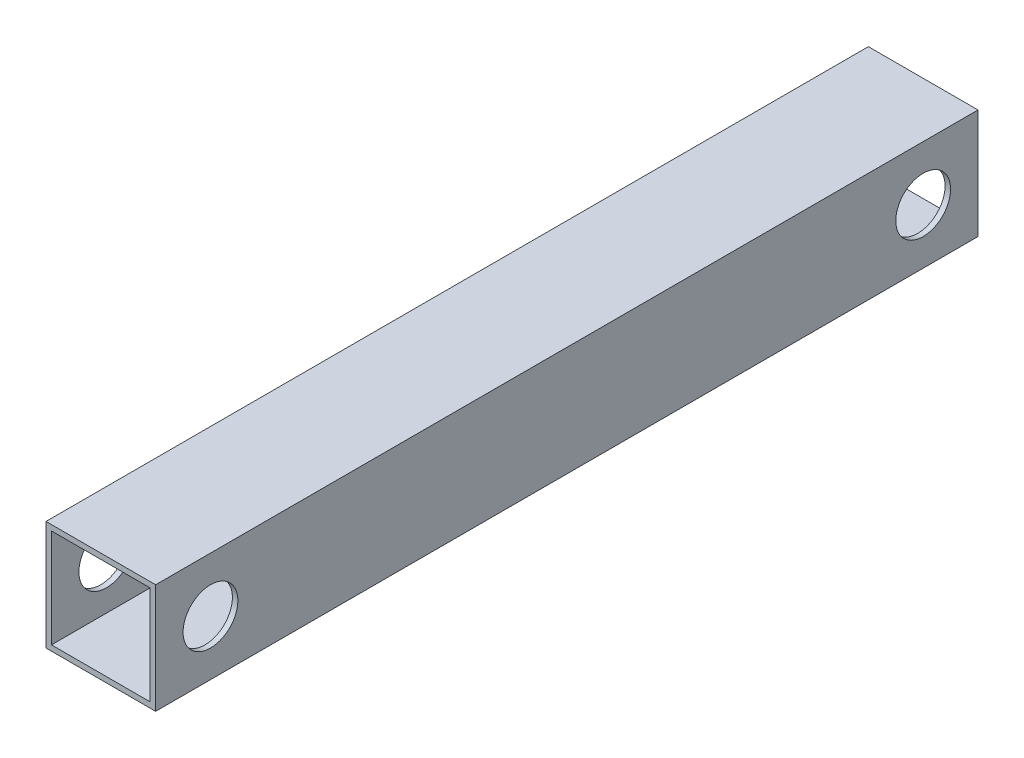
ISO-10303-21;
HEADER;
FILE_DESCRIPTION(('STEP AP214'),'2;1');
FILE_NAME('part.step','',(''),(''),'','','');
FILE_SCHEMA(('AUTOMOTIVE_DESIGN { 1 0 10303 214 1 1 1 1 }'));
ENDSEC;
DATA;
#1=APPLICATION_CONTEXT('core data for automotive mechanical design processes');
#2=APPLICATION_PROTOCOL_DEFINITION('international standard','automotive_design',2000,#1);
#3=PRODUCT_CONTEXT('',#1,'mechanical');
#4=PRODUCT('Part','Part','',(#3));
#5=PRODUCT_RELATED_PRODUCT_CATEGORY('part','',(#4));
#6=PRODUCT_DEFINITION_FORMATION('','',#4);
#7=PRODUCT_DEFINITION_CONTEXT('part definition',#1,'design');
#8=PRODUCT_DEFINITION('design','',#6,#7);
#9=PRODUCT_DEFINITION_SHAPE('','',#8);
#10=(LENGTH_UNIT() NAMED_UNIT(*) SI_UNIT(.MILLI.,.METRE.));
#11=(NAMED_UNIT(*) PLANE_ANGLE_UNIT() SI_UNIT($,.RADIAN.));
#12=(NAMED_UNIT(*) SI_UNIT($,.STERADIAN.) SOLID_ANGLE_UNIT());
#13=UNCERTAINTY_MEASURE_WITH_UNIT(LENGTH_MEASURE(1.E-05),#10,'distance_accuracy_value','');
#14=(GEOMETRIC_REPRESENTATION_CONTEXT(3) GLOBAL_UNCERTAINTY_ASSIGNED_CONTEXT((#13)) GLOBAL_UNIT_ASSIGNED_CONTEXT((#10,
#11,#12)) REPRESENTATION_CONTEXT('',''));
#15=CARTESIAN_POINT('',(0.,0.,0.));
#16=DIRECTION('',(0.,0.,1.));
#17=DIRECTION('',(1.,0.,0.));
#18=AXIS2_PLACEMENT_3D('',#15,#16,#17);
#19=CARTESIAN_POINT('',(0.,0.,150.));
#20=DIRECTION('',(0.,0.,-1.));
#21=DIRECTION('',(-1.,0.,0.));
#22=AXIS2_PLACEMENT_3D('',#19,#20,#21);
#23=PLANE('',#22);
#24=DIRECTION('',(0.,1.,0.));
#25=VECTOR('',#24,1.);
#26=CARTESIAN_POINT('',(10.,-10.,150.));
#27=LINE('',#26,#25);
#28=CARTESIAN_POINT('',(10.,-10.,150.));
#29=VERTEX_POINT('',#28);
#30=CARTESIAN_POINT('',(10.,10.,150.));
#31=VERTEX_POINT('',#30);
#32=EDGE_CURVE('E157',#29,#31,#27,.T.);
#33=ORIENTED_EDGE('',*,*,#32,.T.);
#34=DIRECTION('',(-1.,0.,0.));
#35=VECTOR('',#34,1.);
#36=CARTESIAN_POINT('',(-10.,10.,150.));
#37=LINE('',#36,#35);
#38=CARTESIAN_POINT('',(-10.,10.,150.));
#39=VERTEX_POINT('',#38);
#40=EDGE_CURVE('E161',#31,#39,#37,.T.);
#41=ORIENTED_EDGE('',*,*,#40,.T.);
#42=DIRECTION('',(0.,-1.,0.));
#43=VECTOR('',#42,1.);
#44=CARTESIAN_POINT('',(-10.,-10.,150.));
#45=LINE('',#44,#43);
#46=CARTESIAN_POINT('',(-10.,-10.,150.));
#47=VERTEX_POINT('',#46);
#48=EDGE_CURVE('E165',#39,#47,#45,.T.);
#49=ORIENTED_EDGE('',*,*,#48,.T.);
#50=DIRECTION('',(1.,0.,0.));
#51=VECTOR('',#50,1.);
#52=CARTESIAN_POINT('',(-10.,-10.,150.));
#53=LINE('',#52,#51);
#54=EDGE_CURVE('E168',#47,#29,#53,.T.);
#55=ORIENTED_EDGE('',*,*,#54,.T.);
#56=EDGE_LOOP('',(#33,#41,#49,#55));
#57=FACE_BOUND('',#56,.T.);
#58=DIRECTION('',(0.,1.,0.));
#59=VECTOR('',#58,1.);
#60=CARTESIAN_POINT('',(9.,9.,150.));
#61=LINE('',#60,#59);
#62=CARTESIAN_POINT('',(9.,-9.,150.));
#63=VERTEX_POINT('',#62);
#64=CARTESIAN_POINT('',(9.,9.,150.));
#65=VERTEX_POINT('',#64);
#66=EDGE_CURVE('E107',#63,#65,#61,.T.);
#67=ORIENTED_EDGE('',*,*,#66,.F.);
#68=DIRECTION('',(1.,0.,0.));
#69=VECTOR('',#68,1.);
#70=CARTESIAN_POINT('',(-9.,-9.,150.));
#71=LINE('',#70,#69);
#72=CARTESIAN_POINT('',(-9.,-9.,150.));
#73=VERTEX_POINT('',#72);
#74=EDGE_CURVE('E133',#73,#63,#71,.T.);
#75=ORIENTED_EDGE('',*,*,#74,.F.);
#76=DIRECTION('',(0.,-1.,0.));
#77=VECTOR('',#76,1.);
#78=CARTESIAN_POINT('',(-9.,9.,150.));
#79=LINE('',#78,#77);
#80=CARTESIAN_POINT('',(-9.,9.,150.));
#81=VERTEX_POINT('',#80);
#82=EDGE_CURVE('E129',#81,#73,#79,.T.);
#83=ORIENTED_EDGE('',*,*,#82,.F.);
#84=DIRECTION('',(-1.,0.,0.));
#85=VECTOR('',#84,1.);
#86=CARTESIAN_POINT('',(-9.,9.,150.));
#87=LINE('',#86,#85);
#88=EDGE_CURVE('E116',#65,#81,#87,.T.);
#89=ORIENTED_EDGE('',*,*,#88,.F.);
#90=EDGE_LOOP('',(#67,#75,#83,#89));
#91=FACE_BOUND('',#90,.T.);
#92=ADVANCED_FACE('F39',(#57,#91),#23,.F.);
#93=CARTESIAN_POINT('',(0.,0.,0.));
#94=DIRECTION('',(0.,0.,-1.));
#95=DIRECTION('',(-1.,0.,0.));
#96=AXIS2_PLACEMENT_3D('',#93,#94,#95);
#97=PLANE('',#96);
#98=DIRECTION('',(0.,1.,0.));
#99=VECTOR('',#98,1.);
#100=CARTESIAN_POINT('',(10.,-10.,0.));
#101=LINE('',#100,#99);
#102=CARTESIAN_POINT('',(10.,-10.,0.));
#103=VERTEX_POINT('',#102);
#104=CARTESIAN_POINT('',(10.,10.,0.));
#105=VERTEX_POINT('',#104);
#106=EDGE_CURVE('E125',#103,#105,#101,.T.);
#107=ORIENTED_EDGE('',*,*,#106,.F.);
#108=DIRECTION('',(1.,0.,0.));
#109=VECTOR('',#108,1.);
#110=CARTESIAN_POINT('',(-10.,-10.,0.));
#111=LINE('',#110,#109);
#112=CARTESIAN_POINT('',(-10.,-10.,0.));
#113=VERTEX_POINT('',#112);
#114=EDGE_CURVE('E162',#113,#103,#111,.T.);
#115=ORIENTED_EDGE('',*,*,#114,.F.);
#116=DIRECTION('',(0.,-1.,0.));
#117=VECTOR('',#116,1.);
#118=CARTESIAN_POINT('',(-10.,-10.,0.));
#119=LINE('',#118,#117);
#120=CARTESIAN_POINT('',(-10.,10.,0.));
#121=VERTEX_POINT('',#120);
#122=EDGE_CURVE('E178',#121,#113,#119,.T.);
#123=ORIENTED_EDGE('',*,*,#122,.F.);
#124=DIRECTION('',(-1.,0.,0.));
#125=VECTOR('',#124,1.);
#126=CARTESIAN_POINT('',(-10.,10.,0.));
#127=LINE('',#126,#125);
#128=EDGE_CURVE('E175',#105,#121,#127,.T.);
#129=ORIENTED_EDGE('',*,*,#128,.F.);
#130=EDGE_LOOP('',(#107,#115,#123,#129));
#131=FACE_BOUND('',#130,.T.);
#132=DIRECTION('',(1.,0.,0.));
#133=VECTOR('',#132,1.);
#134=CARTESIAN_POINT('',(-9.,-9.,0.));
#135=LINE('',#134,#133);
#136=CARTESIAN_POINT('',(-9.,-9.,0.));
#137=VERTEX_POINT('',#136);
#138=CARTESIAN_POINT('',(9.,-9.,0.));
#139=VERTEX_POINT('',#138);
#140=EDGE_CURVE('E117',#137,#139,#135,.T.);
#141=ORIENTED_EDGE('',*,*,#140,.T.);
#142=DIRECTION('',(0.,1.,0.));
#143=VECTOR('',#142,1.);
#144=CARTESIAN_POINT('',(9.,9.,0.));
#145=LINE('',#144,#143);
#146=CARTESIAN_POINT('',(9.,9.,0.));
#147=VERTEX_POINT('',#146);
#148=EDGE_CURVE('E65',#139,#147,#145,.T.);
#149=ORIENTED_EDGE('',*,*,#148,.T.);
#150=DIRECTION('',(-1.,0.,0.));
#151=VECTOR('',#150,1.);
#152=CARTESIAN_POINT('',(-9.,9.,0.));
#153=LINE('',#152,#151);
#154=CARTESIAN_POINT('',(-9.,9.,0.));
#155=VERTEX_POINT('',#154);
#156=EDGE_CURVE('E123',#147,#155,#153,.T.);
#157=ORIENTED_EDGE('',*,*,#156,.T.);
#158=DIRECTION('',(0.,-1.,0.));
#159=VECTOR('',#158,1.);
#160=CARTESIAN_POINT('',(-9.,9.,0.));
#161=LINE('',#160,#159);
#162=EDGE_CURVE('E144',#155,#137,#161,.T.);
#163=ORIENTED_EDGE('',*,*,#162,.T.);
#164=EDGE_LOOP('',(#141,#149,#157,#163));
#165=FACE_BOUND('',#164,.T.);
#166=ADVANCED_FACE('F244',(#131,#165),#97,.T.);
#167=CARTESIAN_POINT('',(10.,-10.,150.));
#168=DIRECTION('',(-1.,0.,0.));
#169=DIRECTION('',(0.,0.,1.));
#170=AXIS2_PLACEMENT_3D('',#167,#168,#169);
#171=PLANE('',#170);
#172=CARTESIAN_POINT('',(10.,0.,140.));
#173=DIRECTION('',(1.,0.,0.));
#174=DIRECTION('',(0.,0.,-1.));
#175=AXIS2_PLACEMENT_3D('',#172,#173,#174);
#176=CIRCLE('',#175,5.00000000000002);
#177=CARTESIAN_POINT('',(10.,0.,135.));
#178=VERTEX_POINT('',#177);
#179=EDGE_CURVE('E196',#178,#178,#176,.T.);
#180=ORIENTED_EDGE('',*,*,#179,.F.);
#181=EDGE_LOOP('',(#180));
#182=FACE_BOUND('',#181,.T.);
#183=CARTESIAN_POINT('',(10.,0.,10.));
#184=DIRECTION('',(1.,0.,0.));
#185=DIRECTION('',(0.,0.,1.));
#186=AXIS2_PLACEMENT_3D('',#183,#184,#185);
#187=CIRCLE('',#186,5.00000000000002);
#188=CARTESIAN_POINT('',(10.,0.,15.));
#189=VERTEX_POINT('',#188);
#190=EDGE_CURVE('E205',#189,#189,#187,.T.);
#191=ORIENTED_EDGE('',*,*,#190,.F.);
#192=EDGE_LOOP('',(#191));
#193=FACE_BOUND('',#192,.T.);
#194=ORIENTED_EDGE('',*,*,#106,.T.);
#195=DIRECTION('',(0.,0.,-1.));
#196=VECTOR('',#195,1.);
#197=CARTESIAN_POINT('',(10.,10.,150.));
#198=LINE('',#197,#196);
#199=EDGE_CURVE('E11',#31,#105,#198,.T.);
#200=ORIENTED_EDGE('',*,*,#199,.F.);
#201=ORIENTED_EDGE('',*,*,#32,.F.);
#202=DIRECTION('',(0.,0.,-1.));
#203=VECTOR('',#202,1.);
#204=CARTESIAN_POINT('',(10.,-10.,150.));
#205=LINE('',#204,#203);
#206=EDGE_CURVE('E171',#29,#103,#205,.T.);
#207=ORIENTED_EDGE('',*,*,#206,.T.);
#208=EDGE_LOOP('',(#194,#200,#201,#207));
#209=FACE_BOUND('',#208,.T.);
#210=ADVANCED_FACE('F41',(#182,#193,#209),#171,.F.);
#211=CARTESIAN_POINT('',(-10.,10.,150.));
#212=DIRECTION('',(0.,-1.,0.));
#213=DIRECTION('',(0.,0.,-1.));
#214=AXIS2_PLACEMENT_3D('',#211,#212,#213);
#215=PLANE('',#214);
#216=ORIENTED_EDGE('',*,*,#128,.T.);
#217=DIRECTION('',(0.,0.,-1.));
#218=VECTOR('',#217,1.);
#219=CARTESIAN_POINT('',(-10.,10.,150.));
#220=LINE('',#219,#218);
#221=EDGE_CURVE('E49',#39,#121,#220,.T.);
#222=ORIENTED_EDGE('',*,*,#221,.F.);
#223=ORIENTED_EDGE('',*,*,#40,.F.);
#224=ORIENTED_EDGE('',*,*,#199,.T.);
#225=EDGE_LOOP('',(#216,#222,#223,#224));
#226=FACE_BOUND('',#225,.T.);
#227=ADVANCED_FACE('F260',(#226),#215,.F.);
#228=CARTESIAN_POINT('',(-10.,-10.,150.));
#229=DIRECTION('',(1.,0.,0.));
#230=DIRECTION('',(0.,0.,-1.));
#231=AXIS2_PLACEMENT_3D('',#228,#229,#230);
#232=PLANE('',#231);
#233=CARTESIAN_POINT('',(-10.,0.,140.));
#234=DIRECTION('',(1.,0.,0.));
#235=DIRECTION('',(0.,0.,-1.));
#236=AXIS2_PLACEMENT_3D('',#233,#234,#235);
#237=CIRCLE('',#236,5.00000000000002);
#238=CARTESIAN_POINT('',(-10.,0.,135.));
#239=VERTEX_POINT('',#238);
#240=EDGE_CURVE('E141',#239,#239,#237,.T.);
#241=ORIENTED_EDGE('',*,*,#240,.T.);
#242=EDGE_LOOP('',(#241));
#243=FACE_BOUND('',#242,.T.);
#244=CARTESIAN_POINT('',(-10.,0.,10.));
#245=DIRECTION('',(1.,0.,0.));
#246=DIRECTION('',(0.,0.,-1.));
#247=AXIS2_PLACEMENT_3D('',#244,#245,#246);
#248=CIRCLE('',#247,5.00000000000002);
#249=CARTESIAN_POINT('',(-10.,0.,4.99999999999999));
#250=VERTEX_POINT('',#249);
#251=EDGE_CURVE('E202',#250,#250,#248,.T.);
#252=ORIENTED_EDGE('',*,*,#251,.T.);
#253=EDGE_LOOP('',(#252));
#254=FACE_BOUND('',#253,.T.);
#255=ORIENTED_EDGE('',*,*,#122,.T.);
#256=DIRECTION('',(0.,0.,-1.));
#257=VECTOR('',#256,1.);
#258=CARTESIAN_POINT('',(-10.,-10.,150.));
#259=LINE('',#258,#257);
#260=EDGE_CURVE('E186',#47,#113,#259,.T.);
#261=ORIENTED_EDGE('',*,*,#260,.F.);
#262=ORIENTED_EDGE('',*,*,#48,.F.);
#263=ORIENTED_EDGE('',*,*,#221,.T.);
#264=EDGE_LOOP('',(#255,#261,#262,#263));
#265=FACE_BOUND('',#264,.T.);
#266=ADVANCED_FACE('F223',(#243,#254,#265),#232,.F.);
#267=CARTESIAN_POINT('',(-10.,-10.,150.));
#268=DIRECTION('',(0.,1.,0.));
#269=DIRECTION('',(0.,0.,1.));
#270=AXIS2_PLACEMENT_3D('',#267,#268,#269);
#271=PLANE('',#270);
#272=ORIENTED_EDGE('',*,*,#114,.T.);
#273=ORIENTED_EDGE('',*,*,#206,.F.);
#274=ORIENTED_EDGE('',*,*,#54,.F.);
#275=ORIENTED_EDGE('',*,*,#260,.T.);
#276=EDGE_LOOP('',(#272,#273,#274,#275));
#277=FACE_BOUND('',#276,.T.);
#278=ADVANCED_FACE('F255',(#277),#271,.F.);
#279=CARTESIAN_POINT('',(9.,9.,150.));
#280=DIRECTION('',(-1.,0.,0.));
#281=DIRECTION('',(0.,0.,1.));
#282=AXIS2_PLACEMENT_3D('',#279,#280,#281);
#283=PLANE('',#282);
#284=CARTESIAN_POINT('',(9.00000000000001,0.,140.));
#285=DIRECTION('',(-1.,0.,0.));
#286=DIRECTION('',(0.,0.,1.));
#287=AXIS2_PLACEMENT_3D('',#284,#285,#286);
#288=CIRCLE('',#287,5.00000000000002);
#289=CARTESIAN_POINT('',(9.00000000000001,0.,145.));
#290=VERTEX_POINT('',#289);
#291=EDGE_CURVE('E216',#290,#290,#288,.T.);
#292=ORIENTED_EDGE('',*,*,#291,.F.);
#293=EDGE_LOOP('',(#292));
#294=FACE_BOUND('',#293,.T.);
#295=CARTESIAN_POINT('',(9.00000000000001,0.,10.));
#296=DIRECTION('',(-1.,0.,0.));
#297=DIRECTION('',(0.,0.,1.));
#298=AXIS2_PLACEMENT_3D('',#295,#296,#297);
#299=CIRCLE('',#298,5.00000000000002);
#300=CARTESIAN_POINT('',(9.00000000000001,0.,15.));
#301=VERTEX_POINT('',#300);
#302=EDGE_CURVE('E195',#301,#301,#299,.T.);
#303=ORIENTED_EDGE('',*,*,#302,.F.);
#304=EDGE_LOOP('',(#303));
#305=FACE_BOUND('',#304,.T.);
#306=ORIENTED_EDGE('',*,*,#148,.F.);
#307=DIRECTION('',(0.,0.,-1.));
#308=VECTOR('',#307,1.);
#309=CARTESIAN_POINT('',(9.,-9.,150.));
#310=LINE('',#309,#308);
#311=EDGE_CURVE('E111',#63,#139,#310,.T.);
#312=ORIENTED_EDGE('',*,*,#311,.F.);
#313=ORIENTED_EDGE('',*,*,#66,.T.);
#314=DIRECTION('',(0.,0.,-1.));
#315=VECTOR('',#314,1.);
#316=CARTESIAN_POINT('',(9.,9.,150.));
#317=LINE('',#316,#315);
#318=EDGE_CURVE('E110',#65,#147,#317,.T.);
#319=ORIENTED_EDGE('',*,*,#318,.T.);
#320=EDGE_LOOP('',(#306,#312,#313,#319));
#321=FACE_BOUND('',#320,.T.);
#322=ADVANCED_FACE('F109',(#294,#305,#321),#283,.T.);
#323=CARTESIAN_POINT('',(-9.,9.,150.));
#324=DIRECTION('',(0.,-1.,0.));
#325=DIRECTION('',(0.,0.,-1.));
#326=AXIS2_PLACEMENT_3D('',#323,#324,#325);
#327=PLANE('',#326);
#328=ORIENTED_EDGE('',*,*,#156,.F.);
#329=ORIENTED_EDGE('',*,*,#318,.F.);
#330=ORIENTED_EDGE('',*,*,#88,.T.);
#331=DIRECTION('',(0.,0.,-1.));
#332=VECTOR('',#331,1.);
#333=CARTESIAN_POINT('',(-9.,9.,150.));
#334=LINE('',#333,#332);
#335=EDGE_CURVE('E126',#81,#155,#334,.T.);
#336=ORIENTED_EDGE('',*,*,#335,.T.);
#337=EDGE_LOOP('',(#328,#329,#330,#336));
#338=FACE_BOUND('',#337,.T.);
#339=ADVANCED_FACE('F120',(#338),#327,.T.);
#340=CARTESIAN_POINT('',(-9.,9.,150.));
#341=DIRECTION('',(1.,0.,0.));
#342=DIRECTION('',(0.,0.,-1.));
#343=AXIS2_PLACEMENT_3D('',#340,#341,#342);
#344=PLANE('',#343);
#345=CARTESIAN_POINT('',(-9.00000000000001,0.,140.));
#346=DIRECTION('',(1.,0.,0.));
#347=DIRECTION('',(0.,0.,-1.));
#348=AXIS2_PLACEMENT_3D('',#345,#346,#347);
#349=CIRCLE('',#348,5.00000000000002);
#350=CARTESIAN_POINT('',(-9.00000000000001,0.,135.));
#351=VERTEX_POINT('',#350);
#352=EDGE_CURVE('E43',#351,#351,#349,.T.);
#353=ORIENTED_EDGE('',*,*,#352,.F.);
#354=EDGE_LOOP('',(#353));
#355=FACE_BOUND('',#354,.T.);
#356=CARTESIAN_POINT('',(-9.00000000000001,0.,10.));
#357=DIRECTION('',(1.,0.,0.));
#358=DIRECTION('',(0.,0.,-1.));
#359=AXIS2_PLACEMENT_3D('',#356,#357,#358);
#360=CIRCLE('',#359,5.00000000000002);
#361=CARTESIAN_POINT('',(-9.00000000000001,0.,4.99999999999999));
#362=VERTEX_POINT('',#361);
#363=EDGE_CURVE('E192',#362,#362,#360,.T.);
#364=ORIENTED_EDGE('',*,*,#363,.F.);
#365=EDGE_LOOP('',(#364));
#366=FACE_BOUND('',#365,.T.);
#367=ORIENTED_EDGE('',*,*,#162,.F.);
#368=ORIENTED_EDGE('',*,*,#335,.F.);
#369=ORIENTED_EDGE('',*,*,#82,.T.);
#370=DIRECTION('',(0.,0.,-1.));
#371=VECTOR('',#370,1.);
#372=CARTESIAN_POINT('',(-9.,-9.,150.));
#373=LINE('',#372,#371);
#374=EDGE_CURVE('E57',#73,#137,#373,.T.);
#375=ORIENTED_EDGE('',*,*,#374,.T.);
#376=EDGE_LOOP('',(#367,#368,#369,#375));
#377=FACE_BOUND('',#376,.T.);
#378=ADVANCED_FACE('F282',(#355,#366,#377),#344,.T.);
#379=CARTESIAN_POINT('',(-9.,-9.,150.));
#380=DIRECTION('',(0.,1.,0.));
#381=DIRECTION('',(0.,0.,1.));
#382=AXIS2_PLACEMENT_3D('',#379,#380,#381);
#383=PLANE('',#382);
#384=ORIENTED_EDGE('',*,*,#140,.F.);
#385=ORIENTED_EDGE('',*,*,#374,.F.);
#386=ORIENTED_EDGE('',*,*,#74,.T.);
#387=ORIENTED_EDGE('',*,*,#311,.T.);
#388=EDGE_LOOP('',(#384,#385,#386,#387));
#389=FACE_BOUND('',#388,.T.);
#390=ADVANCED_FACE('F239',(#389),#383,.T.);
#391=CARTESIAN_POINT('',(-140.,0.,10.));
#392=DIRECTION('',(1.,0.,0.));
#393=DIRECTION('',(0.,0.,-1.));
#394=AXIS2_PLACEMENT_3D('',#391,#392,#393);
#395=CYLINDRICAL_SURFACE('',#394,5.00000000000002);
#396=ORIENTED_EDGE('',*,*,#363,.T.);
#397=EDGE_LOOP('',(#396));
#398=FACE_BOUND('',#397,.T.);
#399=ORIENTED_EDGE('',*,*,#251,.F.);
#400=EDGE_LOOP('',(#399));
#401=FACE_BOUND('',#400,.T.);
#402=ADVANCED_FACE('F229',(#398,#401),#395,.F.);
#403=CARTESIAN_POINT('',(-140.,0.,140.));
#404=DIRECTION('',(1.,0.,0.));
#405=DIRECTION('',(0.,0.,-1.));
#406=AXIS2_PLACEMENT_3D('',#403,#404,#405);
#407=CYLINDRICAL_SURFACE('',#406,5.00000000000002);
#408=ORIENTED_EDGE('',*,*,#352,.T.);
#409=EDGE_LOOP('',(#408));
#410=FACE_BOUND('',#409,.T.);
#411=ORIENTED_EDGE('',*,*,#240,.F.);
#412=EDGE_LOOP('',(#411));
#413=FACE_BOUND('',#412,.T.);
#414=ADVANCED_FACE('F226',(#410,#413),#407,.F.);
#415=ORIENTED_EDGE('',*,*,#302,.T.);
#416=EDGE_LOOP('',(#415));
#417=FACE_BOUND('',#416,.T.);
#418=ORIENTED_EDGE('',*,*,#190,.T.);
#419=EDGE_LOOP('',(#418));
#420=FACE_BOUND('',#419,.T.);
#421=ADVANCED_FACE('F228',(#417,#420),#395,.F.);
#422=ORIENTED_EDGE('',*,*,#291,.T.);
#423=EDGE_LOOP('',(#422));
#424=FACE_BOUND('',#423,.T.);
#425=ORIENTED_EDGE('',*,*,#179,.T.);
#426=EDGE_LOOP('',(#425));
#427=FACE_BOUND('',#426,.T.);
#428=ADVANCED_FACE('F232',(#424,#427),#407,.F.);
#429=CLOSED_SHELL('',(#92,#166,#210,#227,#266,#278,#322,#339,#378,#390,#402,#414,#421,#428));
#430=MANIFOLD_SOLID_BREP('B2',#429);
#431=ADVANCED_BREP_SHAPE_REPRESENTATION('',(#18,#430),#14);
#432=SHAPE_DEFINITION_REPRESENTATION(#9,#431);
ENDSEC;
END-ISO-10303-21;
